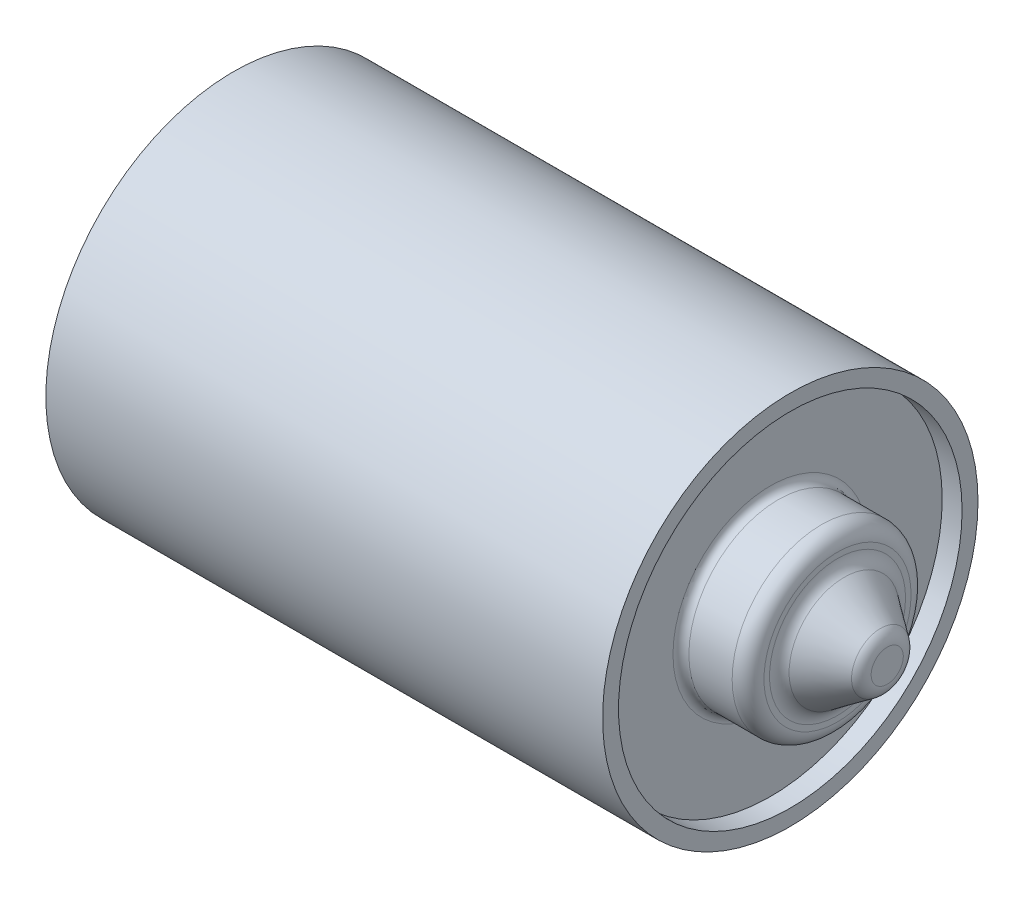
ISO-10303-21;
HEADER;
FILE_DESCRIPTION(('STEP AP214'),'2;1');
FILE_NAME('part.step','',(''),(''),'','','');
FILE_SCHEMA(('AUTOMOTIVE_DESIGN { 1 0 10303 214 1 1 1 1 }'));
ENDSEC;
DATA;
#1=APPLICATION_CONTEXT('core data for automotive mechanical design processes');
#2=APPLICATION_PROTOCOL_DEFINITION('international standard','automotive_design',2000,#1);
#3=PRODUCT_CONTEXT('',#1,'mechanical');
#4=PRODUCT('Part','Part','',(#3));
#5=PRODUCT_RELATED_PRODUCT_CATEGORY('part','',(#4));
#6=PRODUCT_DEFINITION_FORMATION('','',#4);
#7=PRODUCT_DEFINITION_CONTEXT('part definition',#1,'design');
#8=PRODUCT_DEFINITION('design','',#6,#7);
#9=PRODUCT_DEFINITION_SHAPE('','',#8);
#10=(LENGTH_UNIT() NAMED_UNIT(*) SI_UNIT(.MILLI.,.METRE.));
#11=(NAMED_UNIT(*) PLANE_ANGLE_UNIT() SI_UNIT($,.RADIAN.));
#12=(NAMED_UNIT(*) SI_UNIT($,.STERADIAN.) SOLID_ANGLE_UNIT());
#13=UNCERTAINTY_MEASURE_WITH_UNIT(LENGTH_MEASURE(1.E-05),#10,'distance_accuracy_value','');
#14=(GEOMETRIC_REPRESENTATION_CONTEXT(3) GLOBAL_UNCERTAINTY_ASSIGNED_CONTEXT((#13)) GLOBAL_UNIT_ASSIGNED_CONTEXT((#10,
#11,#12)) REPRESENTATION_CONTEXT('',''));
#15=CARTESIAN_POINT('',(0.,0.,0.));
#16=DIRECTION('',(0.,0.,1.));
#17=DIRECTION('',(1.,0.,0.));
#18=AXIS2_PLACEMENT_3D('',#15,#16,#17);
#19=CARTESIAN_POINT('',(670.548001149628,56.8205450457682,38.1099480979795));
#20=DIRECTION('',(1.,0.,0.));
#21=DIRECTION('',(0.,0.,-1.));
#22=AXIS2_PLACEMENT_3D('',#19,#20,#21);
#23=CYLINDRICAL_SURFACE('',#22,29.972);
#24=CARTESIAN_POINT('',(670.548001149628,56.8205450457682,38.1099480979795));
#25=DIRECTION('',(1.,0.,0.));
#26=DIRECTION('',(0.,0.,-1.));
#27=AXIS2_PLACEMENT_3D('',#24,#25,#26);
#28=CIRCLE('',#27,29.972);
#29=CARTESIAN_POINT('',(670.548001149628,56.8205450457682,8.13794809797946));
#30=VERTEX_POINT('',#29);
#31=EDGE_CURVE('E10',#30,#30,#28,.T.);
#32=ORIENTED_EDGE('',*,*,#31,.T.);
#33=EDGE_LOOP('',(#32));
#34=FACE_BOUND('',#33,.T.);
#35=CARTESIAN_POINT('',(759.448001149628,56.8205450457682,38.1099480979795));
#36=DIRECTION('',(1.,0.,0.));
#37=DIRECTION('',(0.,0.,-1.));
#38=AXIS2_PLACEMENT_3D('',#35,#36,#37);
#39=CIRCLE('',#38,29.972);
#40=CARTESIAN_POINT('',(759.448001149628,56.8205450457682,8.13794809797946));
#41=VERTEX_POINT('',#40);
#42=EDGE_CURVE('E72',#41,#41,#39,.T.);
#43=ORIENTED_EDGE('',*,*,#42,.F.);
#44=EDGE_LOOP('',(#43));
#45=FACE_BOUND('',#44,.T.);
#46=ADVANCED_FACE('F32',(#34,#45),#23,.T.);
#47=CARTESIAN_POINT('',(670.548001149628,86.7925450457682,38.1099480979795));
#48=DIRECTION('',(-1.,0.,0.));
#49=DIRECTION('',(0.,0.,1.));
#50=AXIS2_PLACEMENT_3D('',#47,#48,#49);
#51=PLANE('',#50);
#52=ORIENTED_EDGE('',*,*,#31,.F.);
#53=EDGE_LOOP('',(#52));
#54=FACE_BOUND('',#53,.T.);
#55=ADVANCED_FACE('F80',(#54),#51,.T.);
#56=CARTESIAN_POINT('',(774.926761150631,56.8205450457682,38.1099480979795));
#57=DIRECTION('',(1.,0.,0.));
#58=DIRECTION('',(0.,0.,-1.));
#59=AXIS2_PLACEMENT_3D('',#56,#57,#58);
#60=PLANE('',#59);
#61=CARTESIAN_POINT('',(774.92676115063,56.8205450457682,38.1099480979795));
#62=DIRECTION('',(1.,0.,0.));
#63=DIRECTION('',(0.,0.,-1.));
#64=AXIS2_PLACEMENT_3D('',#61,#62,#63);
#65=CIRCLE('',#64,2.56780506428231);
#66=CARTESIAN_POINT('',(774.92676115063,56.8205450457682,35.5421430336971));
#67=VERTEX_POINT('',#66);
#68=EDGE_CURVE('E38',#67,#67,#65,.T.);
#69=ORIENTED_EDGE('',*,*,#68,.T.);
#70=EDGE_LOOP('',(#69));
#71=FACE_BOUND('',#70,.T.);
#72=ADVANCED_FACE('F84',(#71),#60,.T.);
#73=CARTESIAN_POINT('',(772.386761149997,56.8205450457682,38.1099480979795));
#74=DIRECTION('',(1.,0.,0.));
#75=DIRECTION('',(0.,0.,-1.));
#76=AXIS2_PLACEMENT_3D('',#73,#74,#75);
#77=TOROIDAL_SURFACE('',#76,2.56780506428231,2.54000000063392);
#78=CARTESIAN_POINT('',(773.864951800249,56.8205450457682,38.1099480979795));
#79=DIRECTION('',(1.,0.,0.));
#80=DIRECTION('',(0.,0.,-1.));
#81=AXIS2_PLACEMENT_3D('',#78,#79,#80);
#82=CIRCLE('',#81,4.63336852366254);
#83=CARTESIAN_POINT('',(773.864951800249,56.8205450457682,33.4765795743169));
#84=VERTEX_POINT('',#83);
#85=EDGE_CURVE('E42',#84,#84,#82,.T.);
#86=ORIENTED_EDGE('',*,*,#85,.T.);
#87=EDGE_LOOP('',(#86));
#88=FACE_BOUND('',#87,.T.);
#89=ORIENTED_EDGE('',*,*,#68,.F.);
#90=EDGE_LOOP('',(#89));
#91=FACE_BOUND('',#90,.T.);
#92=ADVANCED_FACE('F89',(#88,#91),#77,.T.);
#93=CARTESIAN_POINT('',(773.864951800249,56.8205450457682,38.1099480979795));
#94=DIRECTION('',(-1.,0.,0.));
#95=DIRECTION('',(0.,0.,1.));
#96=AXIS2_PLACEMENT_3D('',#93,#94,#95);
#97=CONICAL_SURFACE('',#96,4.63336852366254,0.621142728145819);
#98=CARTESIAN_POINT('',(768.051070499744,56.8205450457682,38.1099480979795));
#99=DIRECTION('',(1.,0.,0.));
#100=DIRECTION('',(0.,0.,-1.));
#101=AXIS2_PLACEMENT_3D('',#98,#99,#100);
#102=CIRCLE('',#101,8.7939886881292);
#103=CARTESIAN_POINT('',(768.051070499744,56.8205450457682,29.3159594098503));
#104=VERTEX_POINT('',#103);
#105=EDGE_CURVE('E46',#104,#104,#102,.T.);
#106=ORIENTED_EDGE('',*,*,#105,.T.);
#107=EDGE_LOOP('',(#106));
#108=FACE_BOUND('',#107,.T.);
#109=ORIENTED_EDGE('',*,*,#85,.F.);
#110=EDGE_LOOP('',(#109));
#111=FACE_BOUND('',#110,.T.);
#112=ADVANCED_FACE('F94',(#108,#111),#97,.T.);
#113=CARTESIAN_POINT('',(769.529261149628,56.8205450457682,38.1099480979795));
#114=DIRECTION('',(1.,0.,0.));
#115=DIRECTION('',(0.,0.,-1.));
#116=AXIS2_PLACEMENT_3D('',#113,#114,#115);
#117=TOROIDAL_SURFACE('',#116,10.8595521469937,2.53999999999974);
#118=CARTESIAN_POINT('',(766.989261149628,56.8205450457682,38.1099480979795));
#119=DIRECTION('',(1.,0.,0.));
#120=DIRECTION('',(0.,0.,-1.));
#121=AXIS2_PLACEMENT_3D('',#118,#119,#120);
#122=CIRCLE('',#121,10.8595521469941);
#123=CARTESIAN_POINT('',(766.989261149628,56.8205450457682,27.2503959509854));
#124=VERTEX_POINT('',#123);
#125=EDGE_CURVE('E51',#124,#124,#122,.T.);
#126=ORIENTED_EDGE('',*,*,#125,.T.);
#127=EDGE_LOOP('',(#126));
#128=FACE_BOUND('',#127,.T.);
#129=ORIENTED_EDGE('',*,*,#105,.F.);
#130=EDGE_LOOP('',(#129));
#131=FACE_BOUND('',#130,.T.);
#132=ADVANCED_FACE('F98',(#128,#131),#117,.F.);
#133=CARTESIAN_POINT('',(766.989261149628,67.6800971927623,38.1099480979795));
#134=DIRECTION('',(1.,0.,0.));
#135=DIRECTION('',(0.,0.,-1.));
#136=AXIS2_PLACEMENT_3D('',#133,#134,#135);
#137=PLANE('',#136);
#138=CARTESIAN_POINT('',(766.989261149628,56.8205450457682,38.1099480979795));
#139=DIRECTION('',(1.,0.,0.));
#140=DIRECTION('',(0.,0.,-1.));
#141=AXIS2_PLACEMENT_3D('',#138,#139,#140);
#142=CIRCLE('',#141,11.7475000000001);
#143=CARTESIAN_POINT('',(766.989261149628,56.8205450457682,26.3624480979794));
#144=VERTEX_POINT('',#143);
#145=EDGE_CURVE('E54',#144,#144,#142,.T.);
#146=ORIENTED_EDGE('',*,*,#145,.T.);
#147=EDGE_LOOP('',(#146));
#148=FACE_BOUND('',#147,.T.);
#149=ORIENTED_EDGE('',*,*,#125,.F.);
#150=EDGE_LOOP('',(#149));
#151=FACE_BOUND('',#150,.T.);
#152=ADVANCED_FACE('F102',(#148,#151),#137,.T.);
#153=CARTESIAN_POINT('',(764.449261149628,56.8205450457682,38.1099480979795));
#154=DIRECTION('',(1.,0.,0.));
#155=DIRECTION('',(0.,0.,-1.));
#156=AXIS2_PLACEMENT_3D('',#153,#154,#155);
#157=TOROIDAL_SURFACE('',#156,11.7475,2.54000000000001);
#158=CARTESIAN_POINT('',(764.449261149628,56.8205450457682,38.1099480979795));
#159=DIRECTION('',(1.,0.,0.));
#160=DIRECTION('',(0.,0.,-1.));
#161=AXIS2_PLACEMENT_3D('',#158,#159,#160);
#162=CIRCLE('',#161,14.2875);
#163=CARTESIAN_POINT('',(764.449261149628,56.8205450457682,23.8224480979795));
#164=VERTEX_POINT('',#163);
#165=EDGE_CURVE('E57',#164,#164,#162,.T.);
#166=ORIENTED_EDGE('',*,*,#165,.T.);
#167=EDGE_LOOP('',(#166));
#168=FACE_BOUND('',#167,.T.);
#169=ORIENTED_EDGE('',*,*,#145,.F.);
#170=EDGE_LOOP('',(#169));
#171=FACE_BOUND('',#170,.T.);
#172=ADVANCED_FACE('F106',(#168,#171),#157,.T.);
#173=CARTESIAN_POINT('',(670.548001149628,56.8205450457682,38.1099480979795));
#174=DIRECTION('',(1.,0.,0.));
#175=DIRECTION('',(0.,0.,-1.));
#176=AXIS2_PLACEMENT_3D('',#173,#174,#175);
#177=CYLINDRICAL_SURFACE('',#176,14.2875);
#178=CARTESIAN_POINT('',(757.543001149628,56.8205450457682,38.1099480979795));
#179=DIRECTION('',(1.,0.,0.));
#180=DIRECTION('',(0.,0.,-1.));
#181=AXIS2_PLACEMENT_3D('',#178,#179,#180);
#182=CIRCLE('',#181,14.2875);
#183=CARTESIAN_POINT('',(757.543001149628,56.8205450457682,23.8224480979794));
#184=VERTEX_POINT('',#183);
#185=EDGE_CURVE('E60',#184,#184,#182,.T.);
#186=ORIENTED_EDGE('',*,*,#185,.T.);
#187=EDGE_LOOP('',(#186));
#188=FACE_BOUND('',#187,.T.);
#189=ORIENTED_EDGE('',*,*,#165,.F.);
#190=EDGE_LOOP('',(#189));
#191=FACE_BOUND('',#190,.T.);
#192=ADVANCED_FACE('F110',(#188,#191),#177,.T.);
#193=CARTESIAN_POINT('',(757.543001149628,56.8205450457682,38.1099480979795));
#194=DIRECTION('',(1.,0.,0.));
#195=DIRECTION('',(0.,0.,-1.));
#196=AXIS2_PLACEMENT_3D('',#193,#194,#195);
#197=TOROIDAL_SURFACE('',#196,15.5575000000001,1.27000000000003);
#198=CARTESIAN_POINT('',(756.273001149628,56.8205450457682,38.1099480979795));
#199=DIRECTION('',(1.,0.,0.));
#200=DIRECTION('',(0.,0.,-1.));
#201=AXIS2_PLACEMENT_3D('',#198,#199,#200);
#202=CIRCLE('',#201,15.5575);
#203=CARTESIAN_POINT('',(756.273001149628,56.8205450457682,22.5524480979794));
#204=VERTEX_POINT('',#203);
#205=EDGE_CURVE('E63',#204,#204,#202,.T.);
#206=ORIENTED_EDGE('',*,*,#205,.T.);
#207=EDGE_LOOP('',(#206));
#208=FACE_BOUND('',#207,.T.);
#209=ORIENTED_EDGE('',*,*,#185,.F.);
#210=EDGE_LOOP('',(#209));
#211=FACE_BOUND('',#210,.T.);
#212=ADVANCED_FACE('F114',(#208,#211),#197,.F.);
#213=CARTESIAN_POINT('',(756.273001149628,72.3780450457682,38.1099480979795));
#214=DIRECTION('',(1.,0.,0.));
#215=DIRECTION('',(0.,0.,-1.));
#216=AXIS2_PLACEMENT_3D('',#213,#214,#215);
#217=PLANE('',#216);
#218=CARTESIAN_POINT('',(756.273001149628,56.8205450457682,38.1099480979795));
#219=DIRECTION('',(1.,0.,0.));
#220=DIRECTION('',(0.,0.,-1.));
#221=AXIS2_PLACEMENT_3D('',#218,#219,#220);
#222=CIRCLE('',#221,27.432);
#223=CARTESIAN_POINT('',(756.273001149628,56.8205450457682,10.6779480979795));
#224=VERTEX_POINT('',#223);
#225=EDGE_CURVE('E66',#224,#224,#222,.T.);
#226=ORIENTED_EDGE('',*,*,#225,.T.);
#227=EDGE_LOOP('',(#226));
#228=FACE_BOUND('',#227,.T.);
#229=ORIENTED_EDGE('',*,*,#205,.F.);
#230=EDGE_LOOP('',(#229));
#231=FACE_BOUND('',#230,.T.);
#232=ADVANCED_FACE('F118',(#228,#231),#217,.T.);
#233=CARTESIAN_POINT('',(670.548001149628,56.8205450457682,38.1099480979795));
#234=DIRECTION('',(1.,0.,0.));
#235=DIRECTION('',(0.,0.,-1.));
#236=AXIS2_PLACEMENT_3D('',#233,#234,#235);
#237=CYLINDRICAL_SURFACE('',#236,27.432);
#238=CARTESIAN_POINT('',(759.448001149628,56.8205450457682,38.1099480979795));
#239=DIRECTION('',(1.,0.,0.));
#240=DIRECTION('',(0.,0.,-1.));
#241=AXIS2_PLACEMENT_3D('',#238,#239,#240);
#242=CIRCLE('',#241,27.432);
#243=CARTESIAN_POINT('',(759.448001149628,56.8205450457682,10.6779480979795));
#244=VERTEX_POINT('',#243);
#245=EDGE_CURVE('E69',#244,#244,#242,.T.);
#246=ORIENTED_EDGE('',*,*,#245,.T.);
#247=EDGE_LOOP('',(#246));
#248=FACE_BOUND('',#247,.T.);
#249=ORIENTED_EDGE('',*,*,#225,.F.);
#250=EDGE_LOOP('',(#249));
#251=FACE_BOUND('',#250,.T.);
#252=ADVANCED_FACE('F122',(#248,#251),#237,.F.);
#253=CARTESIAN_POINT('',(759.448001149628,84.2525450457682,38.1099480979795));
#254=DIRECTION('',(1.,0.,0.));
#255=DIRECTION('',(0.,0.,-1.));
#256=AXIS2_PLACEMENT_3D('',#253,#254,#255);
#257=PLANE('',#256);
#258=ORIENTED_EDGE('',*,*,#42,.T.);
#259=EDGE_LOOP('',(#258));
#260=FACE_BOUND('',#259,.T.);
#261=ORIENTED_EDGE('',*,*,#245,.F.);
#262=EDGE_LOOP('',(#261));
#263=FACE_BOUND('',#262,.T.);
#264=ADVANCED_FACE('F76',(#260,#263),#257,.T.);
#265=CLOSED_SHELL('',(#46,#55,#72,#92,#112,#132,#152,#172,#192,#212,#232,#252,#264));
#266=MANIFOLD_SOLID_BREP('B2',#265);
#267=ADVANCED_BREP_SHAPE_REPRESENTATION('',(#18,#266),#14);
#268=SHAPE_DEFINITION_REPRESENTATION(#9,#267);
ENDSEC;
END-ISO-10303-21;
